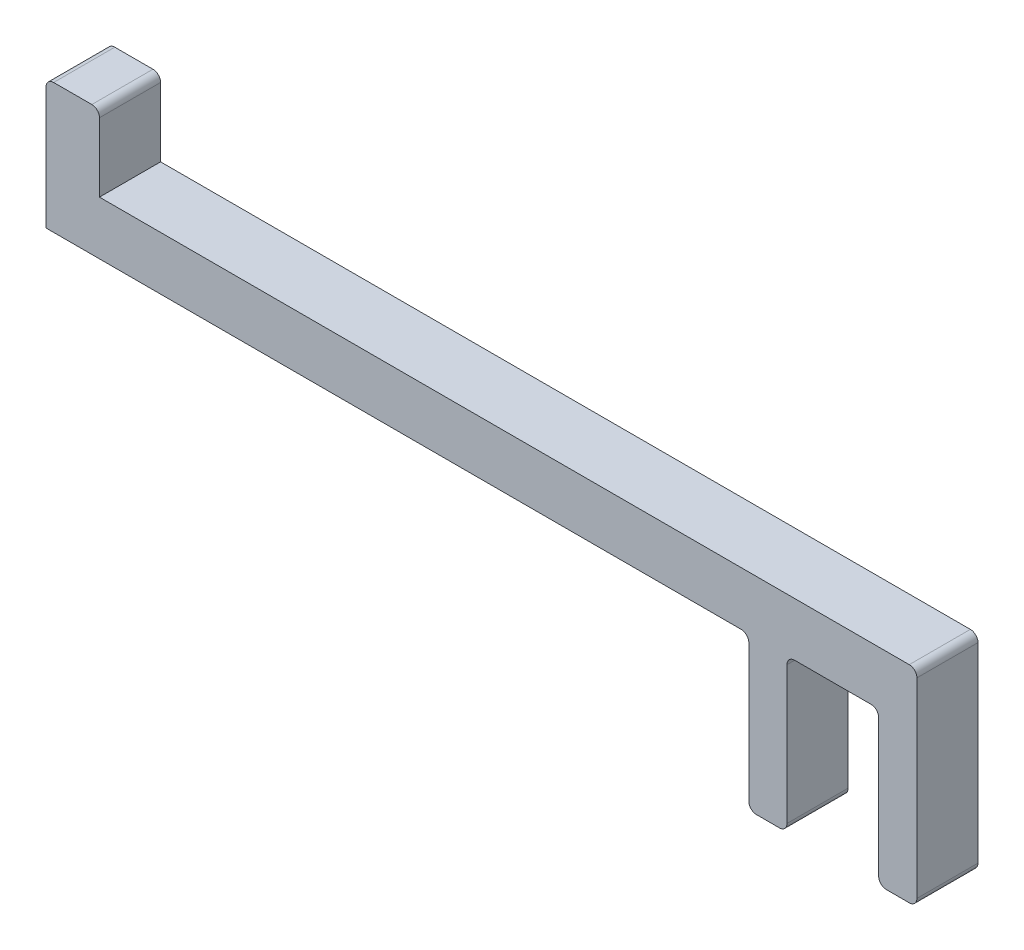
ISO-10303-21;
HEADER;
FILE_DESCRIPTION(('STEP AP214'),'2;1');
FILE_NAME('part.step','',(''),(''),'','','');
FILE_SCHEMA(('AUTOMOTIVE_DESIGN { 1 0 10303 214 1 1 1 1 }'));
ENDSEC;
DATA;
#1=APPLICATION_CONTEXT('core data for automotive mechanical design processes');
#2=APPLICATION_PROTOCOL_DEFINITION('international standard','automotive_design',2000,#1);
#3=PRODUCT_CONTEXT('',#1,'mechanical');
#4=PRODUCT('Part','Part','',(#3));
#5=PRODUCT_RELATED_PRODUCT_CATEGORY('part','',(#4));
#6=PRODUCT_DEFINITION_FORMATION('','',#4);
#7=PRODUCT_DEFINITION_CONTEXT('part definition',#1,'design');
#8=PRODUCT_DEFINITION('design','',#6,#7);
#9=PRODUCT_DEFINITION_SHAPE('','',#8);
#10=(LENGTH_UNIT() NAMED_UNIT(*) SI_UNIT(.MILLI.,.METRE.));
#11=(NAMED_UNIT(*) PLANE_ANGLE_UNIT() SI_UNIT($,.RADIAN.));
#12=(NAMED_UNIT(*) SI_UNIT($,.STERADIAN.) SOLID_ANGLE_UNIT());
#13=UNCERTAINTY_MEASURE_WITH_UNIT(LENGTH_MEASURE(1.E-05),#10,'distance_accuracy_value','');
#14=(GEOMETRIC_REPRESENTATION_CONTEXT(3) GLOBAL_UNCERTAINTY_ASSIGNED_CONTEXT((#13)) GLOBAL_UNIT_ASSIGNED_CONTEXT((#10,
#11,#12)) REPRESENTATION_CONTEXT('',''));
#15=CARTESIAN_POINT('',(0.,0.,0.));
#16=DIRECTION('',(0.,0.,1.));
#17=DIRECTION('',(1.,0.,0.));
#18=AXIS2_PLACEMENT_3D('',#15,#16,#17);
#19=CARTESIAN_POINT('',(42.2657108504677,-1.,12.));
#20=DIRECTION('',(0.,0.,-1.));
#21=DIRECTION('',(-1.,0.,0.));
#22=AXIS2_PLACEMENT_3D('',#19,#20,#21);
#23=CYLINDRICAL_SURFACE('',#22,1.);
#24=DIRECTION('',(0.,0.,-1.));
#25=VECTOR('',#24,1.);
#26=CARTESIAN_POINT('',(42.2657108504677,0.,12.));
#27=LINE('',#26,#25);
#28=CARTESIAN_POINT('',(42.2657108504677,0.,12.));
#29=VERTEX_POINT('',#28);
#30=CARTESIAN_POINT('',(42.2657108504677,0.,4.00000000000001));
#31=VERTEX_POINT('',#30);
#32=EDGE_CURVE('E271',#29,#31,#27,.T.);
#33=ORIENTED_EDGE('',*,*,#32,.T.);
#34=CARTESIAN_POINT('',(42.2657108504677,-1.,4.00000000000001));
#35=DIRECTION('',(0.,0.,1.));
#36=DIRECTION('',(1.,0.,0.));
#37=AXIS2_PLACEMENT_3D('',#34,#35,#36);
#38=CIRCLE('',#37,1.);
#39=CARTESIAN_POINT('',(43.2657108504677,-1.,4.00000000000001));
#40=VERTEX_POINT('',#39);
#41=EDGE_CURVE('E49',#31,#40,#38,.F.);
#42=ORIENTED_EDGE('',*,*,#41,.T.);
#43=DIRECTION('',(0.,0.,-1.));
#44=VECTOR('',#43,1.);
#45=CARTESIAN_POINT('',(43.2657108504677,-1.,12.));
#46=LINE('',#45,#44);
#47=CARTESIAN_POINT('',(43.2657108504677,-1.,12.));
#48=VERTEX_POINT('',#47);
#49=EDGE_CURVE('E42',#48,#40,#46,.T.);
#50=ORIENTED_EDGE('',*,*,#49,.F.);
#51=CARTESIAN_POINT('',(42.2657108504677,-1.,12.));
#52=DIRECTION('',(0.,0.,-1.));
#53=DIRECTION('',(-1.,0.,0.));
#54=AXIS2_PLACEMENT_3D('',#51,#52,#53);
#55=CIRCLE('',#54,1.);
#56=EDGE_CURVE('E270',#29,#48,#55,.T.);
#57=ORIENTED_EDGE('',*,*,#56,.F.);
#58=EDGE_LOOP('',(#33,#42,#50,#57));
#59=FACE_BOUND('',#58,.T.);
#60=ADVANCED_FACE('F35',(#59),#23,.F.);
#61=CARTESIAN_POINT('',(43.2657108504677,-1.,12.));
#62=DIRECTION('',(1.,0.,0.));
#63=DIRECTION('',(0.,0.,-1.));
#64=AXIS2_PLACEMENT_3D('',#61,#62,#63);
#65=PLANE('',#64);
#66=ORIENTED_EDGE('',*,*,#49,.T.);
#67=DIRECTION('',(0.,-1.,0.));
#68=VECTOR('',#67,1.);
#69=CARTESIAN_POINT('',(43.2657108504677,-1.,4.00000000000001));
#70=LINE('',#69,#68);
#71=CARTESIAN_POINT('',(43.2657108504677,-19.,4.00000000000001));
#72=VERTEX_POINT('',#71);
#73=EDGE_CURVE('E265',#40,#72,#70,.T.);
#74=ORIENTED_EDGE('',*,*,#73,.T.);
#75=DIRECTION('',(0.,0.,-1.));
#76=VECTOR('',#75,1.);
#77=CARTESIAN_POINT('',(43.2657108504677,-19.,12.));
#78=LINE('',#77,#76);
#79=CARTESIAN_POINT('',(43.2657108504677,-19.,12.));
#80=VERTEX_POINT('',#79);
#81=EDGE_CURVE('E257',#80,#72,#78,.T.);
#82=ORIENTED_EDGE('',*,*,#81,.F.);
#83=DIRECTION('',(0.,-1.,0.));
#84=VECTOR('',#83,1.);
#85=CARTESIAN_POINT('',(43.2657108504677,-1.,12.));
#86=LINE('',#85,#84);
#87=EDGE_CURVE('E266',#48,#80,#86,.T.);
#88=ORIENTED_EDGE('',*,*,#87,.F.);
#89=EDGE_LOOP('',(#66,#74,#82,#88));
#90=FACE_BOUND('',#89,.T.);
#91=ADVANCED_FACE('F263',(#90),#65,.F.);
#92=CARTESIAN_POINT('',(44.2657108504677,-19.,12.));
#93=DIRECTION('',(0.,0.,-1.));
#94=DIRECTION('',(-1.,0.,0.));
#95=AXIS2_PLACEMENT_3D('',#92,#93,#94);
#96=CYLINDRICAL_SURFACE('',#95,1.);
#97=ORIENTED_EDGE('',*,*,#81,.T.);
#98=CARTESIAN_POINT('',(44.2657108504677,-19.,4.00000000000001));
#99=DIRECTION('',(0.,0.,1.));
#100=DIRECTION('',(1.,0.,0.));
#101=AXIS2_PLACEMENT_3D('',#98,#99,#100);
#102=CIRCLE('',#101,1.);
#103=CARTESIAN_POINT('',(44.2657108504677,-20.,4.00000000000001));
#104=VERTEX_POINT('',#103);
#105=EDGE_CURVE('E273',#72,#104,#102,.T.);
#106=ORIENTED_EDGE('',*,*,#105,.T.);
#107=DIRECTION('',(0.,0.,-1.));
#108=VECTOR('',#107,1.);
#109=CARTESIAN_POINT('',(44.2657108504677,-20.,12.));
#110=LINE('',#109,#108);
#111=CARTESIAN_POINT('',(44.2657108504677,-20.,12.));
#112=VERTEX_POINT('',#111);
#113=EDGE_CURVE('E254',#112,#104,#110,.T.);
#114=ORIENTED_EDGE('',*,*,#113,.F.);
#115=CARTESIAN_POINT('',(44.2657108504677,-19.,12.));
#116=DIRECTION('',(0.,0.,1.));
#117=DIRECTION('',(1.,0.,0.));
#118=AXIS2_PLACEMENT_3D('',#115,#116,#117);
#119=CIRCLE('',#118,1.);
#120=EDGE_CURVE('E325',#80,#112,#119,.T.);
#121=ORIENTED_EDGE('',*,*,#120,.F.);
#122=EDGE_LOOP('',(#97,#106,#114,#121));
#123=FACE_BOUND('',#122,.T.);
#124=ADVANCED_FACE('F432',(#123),#96,.T.);
#125=CARTESIAN_POINT('',(44.2657108504677,-20.,12.));
#126=DIRECTION('',(0.,1.,0.));
#127=DIRECTION('',(0.,0.,1.));
#128=AXIS2_PLACEMENT_3D('',#125,#126,#127);
#129=PLANE('',#128);
#130=ORIENTED_EDGE('',*,*,#113,.T.);
#131=DIRECTION('',(1.,0.,0.));
#132=VECTOR('',#131,1.);
#133=CARTESIAN_POINT('',(44.2657108504677,-20.,4.00000000000001));
#134=LINE('',#133,#132);
#135=CARTESIAN_POINT('',(47.2657108504677,-20.,4.00000000000001));
#136=VERTEX_POINT('',#135);
#137=EDGE_CURVE('E279',#104,#136,#134,.T.);
#138=ORIENTED_EDGE('',*,*,#137,.T.);
#139=DIRECTION('',(0.,0.,-1.));
#140=VECTOR('',#139,1.);
#141=CARTESIAN_POINT('',(47.2657108504677,-20.,12.));
#142=LINE('',#141,#140);
#143=CARTESIAN_POINT('',(47.2657108504677,-20.,12.));
#144=VERTEX_POINT('',#143);
#145=EDGE_CURVE('E251',#144,#136,#142,.T.);
#146=ORIENTED_EDGE('',*,*,#145,.F.);
#147=DIRECTION('',(1.,0.,0.));
#148=VECTOR('',#147,1.);
#149=CARTESIAN_POINT('',(44.2657108504677,-20.,12.));
#150=LINE('',#149,#148);
#151=EDGE_CURVE('E327',#112,#144,#150,.T.);
#152=ORIENTED_EDGE('',*,*,#151,.F.);
#153=EDGE_LOOP('',(#130,#138,#146,#152));
#154=FACE_BOUND('',#153,.T.);
#155=ADVANCED_FACE('F429',(#154),#129,.F.);
#156=CARTESIAN_POINT('',(47.2657108504677,-19.,12.));
#157=DIRECTION('',(0.,0.,-1.));
#158=DIRECTION('',(-1.,0.,0.));
#159=AXIS2_PLACEMENT_3D('',#156,#157,#158);
#160=CYLINDRICAL_SURFACE('',#159,1.);
#161=ORIENTED_EDGE('',*,*,#145,.T.);
#162=CARTESIAN_POINT('',(47.2657108504677,-19.,4.));
#163=DIRECTION('',(0.,0.,1.));
#164=DIRECTION('',(1.,0.,0.));
#165=AXIS2_PLACEMENT_3D('',#162,#163,#164);
#166=CIRCLE('',#165,1.);
#167=CARTESIAN_POINT('',(48.2657108504677,-19.,4.));
#168=VERTEX_POINT('',#167);
#169=EDGE_CURVE('E282',#136,#168,#166,.T.);
#170=ORIENTED_EDGE('',*,*,#169,.T.);
#171=DIRECTION('',(0.,0.,-1.));
#172=VECTOR('',#171,1.);
#173=CARTESIAN_POINT('',(48.2657108504677,-19.,12.));
#174=LINE('',#173,#172);
#175=CARTESIAN_POINT('',(48.2657108504677,-19.,12.));
#176=VERTEX_POINT('',#175);
#177=EDGE_CURVE('E248',#176,#168,#174,.T.);
#178=ORIENTED_EDGE('',*,*,#177,.F.);
#179=CARTESIAN_POINT('',(47.2657108504677,-19.,12.));
#180=DIRECTION('',(0.,0.,1.));
#181=DIRECTION('',(1.,0.,0.));
#182=AXIS2_PLACEMENT_3D('',#179,#180,#181);
#183=CIRCLE('',#182,1.);
#184=EDGE_CURVE('E329',#144,#176,#183,.T.);
#185=ORIENTED_EDGE('',*,*,#184,.F.);
#186=EDGE_LOOP('',(#161,#170,#178,#185));
#187=FACE_BOUND('',#186,.T.);
#188=ADVANCED_FACE('F424',(#187),#160,.T.);
#189=CARTESIAN_POINT('',(48.2657108504677,-19.,12.));
#190=DIRECTION('',(-1.,0.,0.));
#191=DIRECTION('',(0.,0.,1.));
#192=AXIS2_PLACEMENT_3D('',#189,#190,#191);
#193=PLANE('',#192);
#194=ORIENTED_EDGE('',*,*,#177,.T.);
#195=DIRECTION('',(0.,1.,0.));
#196=VECTOR('',#195,1.);
#197=CARTESIAN_POINT('',(48.2657108504677,-19.,4.));
#198=LINE('',#197,#196);
#199=CARTESIAN_POINT('',(48.2657108504677,-1.,4.));
#200=VERTEX_POINT('',#199);
#201=EDGE_CURVE('E285',#168,#200,#198,.T.);
#202=ORIENTED_EDGE('',*,*,#201,.T.);
#203=DIRECTION('',(0.,0.,-1.));
#204=VECTOR('',#203,1.);
#205=CARTESIAN_POINT('',(48.2657108504677,-1.,12.));
#206=LINE('',#205,#204);
#207=CARTESIAN_POINT('',(48.2657108504677,-1.,12.));
#208=VERTEX_POINT('',#207);
#209=EDGE_CURVE('E245',#208,#200,#206,.T.);
#210=ORIENTED_EDGE('',*,*,#209,.F.);
#211=DIRECTION('',(0.,1.,0.));
#212=VECTOR('',#211,1.);
#213=CARTESIAN_POINT('',(48.2657108504677,-19.,12.));
#214=LINE('',#213,#212);
#215=EDGE_CURVE('E331',#176,#208,#214,.T.);
#216=ORIENTED_EDGE('',*,*,#215,.F.);
#217=EDGE_LOOP('',(#194,#202,#210,#216));
#218=FACE_BOUND('',#217,.T.);
#219=ADVANCED_FACE('F421',(#218),#193,.F.);
#220=CARTESIAN_POINT('',(49.2657108504677,-1.,12.));
#221=DIRECTION('',(0.,0.,-1.));
#222=DIRECTION('',(-1.,0.,0.));
#223=AXIS2_PLACEMENT_3D('',#220,#221,#222);
#224=CYLINDRICAL_SURFACE('',#223,1.);
#225=ORIENTED_EDGE('',*,*,#209,.T.);
#226=CARTESIAN_POINT('',(49.2657108504677,-1.,4.));
#227=DIRECTION('',(0.,0.,1.));
#228=DIRECTION('',(1.,0.,0.));
#229=AXIS2_PLACEMENT_3D('',#226,#227,#228);
#230=CIRCLE('',#229,1.);
#231=CARTESIAN_POINT('',(49.2657108504677,0.,4.));
#232=VERTEX_POINT('',#231);
#233=EDGE_CURVE('E288',#200,#232,#230,.F.);
#234=ORIENTED_EDGE('',*,*,#233,.T.);
#235=DIRECTION('',(0.,0.,-1.));
#236=VECTOR('',#235,1.);
#237=CARTESIAN_POINT('',(49.2657108504677,0.,12.));
#238=LINE('',#237,#236);
#239=CARTESIAN_POINT('',(49.2657108504677,0.,12.));
#240=VERTEX_POINT('',#239);
#241=EDGE_CURVE('E242',#240,#232,#238,.T.);
#242=ORIENTED_EDGE('',*,*,#241,.F.);
#243=CARTESIAN_POINT('',(49.2657108504677,-1.,12.));
#244=DIRECTION('',(0.,0.,-1.));
#245=DIRECTION('',(-1.,0.,0.));
#246=AXIS2_PLACEMENT_3D('',#243,#244,#245);
#247=CIRCLE('',#246,1.);
#248=EDGE_CURVE('E333',#208,#240,#247,.T.);
#249=ORIENTED_EDGE('',*,*,#248,.F.);
#250=EDGE_LOOP('',(#225,#234,#242,#249));
#251=FACE_BOUND('',#250,.T.);
#252=ADVANCED_FACE('F416',(#251),#224,.F.);
#253=CARTESIAN_POINT('',(49.2657108504677,0.,12.));
#254=DIRECTION('',(0.,1.,0.));
#255=DIRECTION('',(0.,0.,1.));
#256=AXIS2_PLACEMENT_3D('',#253,#254,#255);
#257=PLANE('',#256);
#258=ORIENTED_EDGE('',*,*,#241,.T.);
#259=DIRECTION('',(1.,0.,0.));
#260=VECTOR('',#259,1.);
#261=CARTESIAN_POINT('',(49.2657108504677,0.,4.));
#262=LINE('',#261,#260);
#263=CARTESIAN_POINT('',(59.2657108504677,0.,4.));
#264=VERTEX_POINT('',#263);
#265=EDGE_CURVE('E291',#232,#264,#262,.T.);
#266=ORIENTED_EDGE('',*,*,#265,.T.);
#267=DIRECTION('',(0.,0.,-1.));
#268=VECTOR('',#267,1.);
#269=CARTESIAN_POINT('',(59.2657108504677,0.,12.));
#270=LINE('',#269,#268);
#271=CARTESIAN_POINT('',(59.2657108504677,0.,12.));
#272=VERTEX_POINT('',#271);
#273=EDGE_CURVE('E239',#272,#264,#270,.T.);
#274=ORIENTED_EDGE('',*,*,#273,.F.);
#275=DIRECTION('',(1.,0.,0.));
#276=VECTOR('',#275,1.);
#277=CARTESIAN_POINT('',(49.2657108504677,0.,12.));
#278=LINE('',#277,#276);
#279=EDGE_CURVE('E335',#240,#272,#278,.T.);
#280=ORIENTED_EDGE('',*,*,#279,.F.);
#281=EDGE_LOOP('',(#258,#266,#274,#280));
#282=FACE_BOUND('',#281,.T.);
#283=ADVANCED_FACE('F413',(#282),#257,.F.);
#284=CARTESIAN_POINT('',(59.2657108504677,-1.,12.));
#285=DIRECTION('',(0.,0.,-1.));
#286=DIRECTION('',(-1.,0.,0.));
#287=AXIS2_PLACEMENT_3D('',#284,#285,#286);
#288=CYLINDRICAL_SURFACE('',#287,1.);
#289=ORIENTED_EDGE('',*,*,#273,.T.);
#290=CARTESIAN_POINT('',(59.2657108504677,-1.,4.));
#291=DIRECTION('',(0.,0.,1.));
#292=DIRECTION('',(1.,0.,0.));
#293=AXIS2_PLACEMENT_3D('',#290,#291,#292);
#294=CIRCLE('',#293,1.);
#295=CARTESIAN_POINT('',(60.2657108504677,-1.,4.));
#296=VERTEX_POINT('',#295);
#297=EDGE_CURVE('E294',#264,#296,#294,.F.);
#298=ORIENTED_EDGE('',*,*,#297,.T.);
#299=DIRECTION('',(0.,0.,-1.));
#300=VECTOR('',#299,1.);
#301=CARTESIAN_POINT('',(60.2657108504677,-1.,12.));
#302=LINE('',#301,#300);
#303=CARTESIAN_POINT('',(60.2657108504677,-1.,12.));
#304=VERTEX_POINT('',#303);
#305=EDGE_CURVE('E236',#304,#296,#302,.T.);
#306=ORIENTED_EDGE('',*,*,#305,.F.);
#307=CARTESIAN_POINT('',(59.2657108504677,-1.,12.));
#308=DIRECTION('',(0.,0.,-1.));
#309=DIRECTION('',(-1.,0.,0.));
#310=AXIS2_PLACEMENT_3D('',#307,#308,#309);
#311=CIRCLE('',#310,1.);
#312=EDGE_CURVE('E337',#272,#304,#311,.T.);
#313=ORIENTED_EDGE('',*,*,#312,.F.);
#314=EDGE_LOOP('',(#289,#298,#306,#313));
#315=FACE_BOUND('',#314,.T.);
#316=ADVANCED_FACE('F408',(#315),#288,.F.);
#317=CARTESIAN_POINT('',(60.2657108504677,-1.,12.));
#318=DIRECTION('',(1.,0.,0.));
#319=DIRECTION('',(0.,1.,0.));
#320=AXIS2_PLACEMENT_3D('',#317,#318,#319);
#321=PLANE('',#320);
#322=ORIENTED_EDGE('',*,*,#305,.T.);
#323=DIRECTION('',(0.,-1.,0.));
#324=VECTOR('',#323,1.);
#325=CARTESIAN_POINT('',(60.2657108504677,-1.,4.));
#326=LINE('',#325,#324);
#327=CARTESIAN_POINT('',(60.2657108504677,-19.,4.));
#328=VERTEX_POINT('',#327);
#329=EDGE_CURVE('E297',#296,#328,#326,.T.);
#330=ORIENTED_EDGE('',*,*,#329,.T.);
#331=DIRECTION('',(0.,0.,-1.));
#332=VECTOR('',#331,1.);
#333=CARTESIAN_POINT('',(60.2657108504677,-19.,12.));
#334=LINE('',#333,#332);
#335=CARTESIAN_POINT('',(60.2657108504677,-19.,12.));
#336=VERTEX_POINT('',#335);
#337=EDGE_CURVE('E233',#336,#328,#334,.T.);
#338=ORIENTED_EDGE('',*,*,#337,.F.);
#339=DIRECTION('',(0.,-1.,0.));
#340=VECTOR('',#339,1.);
#341=CARTESIAN_POINT('',(60.2657108504677,-1.,12.));
#342=LINE('',#341,#340);
#343=EDGE_CURVE('E339',#304,#336,#342,.T.);
#344=ORIENTED_EDGE('',*,*,#343,.F.);
#345=EDGE_LOOP('',(#322,#330,#338,#344));
#346=FACE_BOUND('',#345,.T.);
#347=ADVANCED_FACE('F405',(#346),#321,.F.);
#348=CARTESIAN_POINT('',(61.2657108504677,-19.,12.));
#349=DIRECTION('',(0.,0.,-1.));
#350=DIRECTION('',(-1.,0.,0.));
#351=AXIS2_PLACEMENT_3D('',#348,#349,#350);
#352=CYLINDRICAL_SURFACE('',#351,1.);
#353=ORIENTED_EDGE('',*,*,#337,.T.);
#354=CARTESIAN_POINT('',(61.2657108504677,-19.,4.));
#355=DIRECTION('',(0.,0.,1.));
#356=DIRECTION('',(1.,0.,0.));
#357=AXIS2_PLACEMENT_3D('',#354,#355,#356);
#358=CIRCLE('',#357,1.);
#359=CARTESIAN_POINT('',(61.2657108504677,-20.,4.));
#360=VERTEX_POINT('',#359);
#361=EDGE_CURVE('E300',#328,#360,#358,.T.);
#362=ORIENTED_EDGE('',*,*,#361,.T.);
#363=DIRECTION('',(0.,0.,-1.));
#364=VECTOR('',#363,1.);
#365=CARTESIAN_POINT('',(61.2657108504677,-20.,12.));
#366=LINE('',#365,#364);
#367=CARTESIAN_POINT('',(61.2657108504677,-20.,12.));
#368=VERTEX_POINT('',#367);
#369=EDGE_CURVE('E230',#368,#360,#366,.T.);
#370=ORIENTED_EDGE('',*,*,#369,.F.);
#371=CARTESIAN_POINT('',(61.2657108504677,-19.,12.));
#372=DIRECTION('',(0.,0.,1.));
#373=DIRECTION('',(1.,0.,0.));
#374=AXIS2_PLACEMENT_3D('',#371,#372,#373);
#375=CIRCLE('',#374,1.);
#376=EDGE_CURVE('E341',#336,#368,#375,.T.);
#377=ORIENTED_EDGE('',*,*,#376,.F.);
#378=EDGE_LOOP('',(#353,#362,#370,#377));
#379=FACE_BOUND('',#378,.T.);
#380=ADVANCED_FACE('F400',(#379),#352,.T.);
#381=CARTESIAN_POINT('',(61.2657108504677,-20.,12.));
#382=DIRECTION('',(0.,1.,0.));
#383=DIRECTION('',(0.,0.,1.));
#384=AXIS2_PLACEMENT_3D('',#381,#382,#383);
#385=PLANE('',#384);
#386=ORIENTED_EDGE('',*,*,#369,.T.);
#387=DIRECTION('',(1.,0.,0.));
#388=VECTOR('',#387,1.);
#389=CARTESIAN_POINT('',(61.2657108504677,-20.,4.));
#390=LINE('',#389,#388);
#391=CARTESIAN_POINT('',(64.2657108504677,-20.,4.));
#392=VERTEX_POINT('',#391);
#393=EDGE_CURVE('E303',#360,#392,#390,.T.);
#394=ORIENTED_EDGE('',*,*,#393,.T.);
#395=DIRECTION('',(0.,0.,-1.));
#396=VECTOR('',#395,1.);
#397=CARTESIAN_POINT('',(64.2657108504677,-20.,12.));
#398=LINE('',#397,#396);
#399=CARTESIAN_POINT('',(64.2657108504677,-20.,12.));
#400=VERTEX_POINT('',#399);
#401=EDGE_CURVE('E227',#400,#392,#398,.T.);
#402=ORIENTED_EDGE('',*,*,#401,.F.);
#403=DIRECTION('',(1.,0.,0.));
#404=VECTOR('',#403,1.);
#405=CARTESIAN_POINT('',(61.2657108504677,-20.,12.));
#406=LINE('',#405,#404);
#407=EDGE_CURVE('E343',#368,#400,#406,.T.);
#408=ORIENTED_EDGE('',*,*,#407,.F.);
#409=EDGE_LOOP('',(#386,#394,#402,#408));
#410=FACE_BOUND('',#409,.T.);
#411=ADVANCED_FACE('F397',(#410),#385,.F.);
#412=CARTESIAN_POINT('',(64.2657108504677,-19.,12.));
#413=DIRECTION('',(0.,0.,-1.));
#414=DIRECTION('',(-1.,0.,0.));
#415=AXIS2_PLACEMENT_3D('',#412,#413,#414);
#416=CYLINDRICAL_SURFACE('',#415,1.);
#417=ORIENTED_EDGE('',*,*,#401,.T.);
#418=CARTESIAN_POINT('',(64.2657108504677,-19.,4.));
#419=DIRECTION('',(0.,0.,1.));
#420=DIRECTION('',(1.,0.,0.));
#421=AXIS2_PLACEMENT_3D('',#418,#419,#420);
#422=CIRCLE('',#421,1.);
#423=CARTESIAN_POINT('',(65.2657108504677,-19.,4.));
#424=VERTEX_POINT('',#423);
#425=EDGE_CURVE('E306',#392,#424,#422,.T.);
#426=ORIENTED_EDGE('',*,*,#425,.T.);
#427=DIRECTION('',(0.,0.,-1.));
#428=VECTOR('',#427,1.);
#429=CARTESIAN_POINT('',(65.2657108504677,-19.,12.));
#430=LINE('',#429,#428);
#431=CARTESIAN_POINT('',(65.2657108504677,-19.,12.));
#432=VERTEX_POINT('',#431);
#433=EDGE_CURVE('E224',#432,#424,#430,.T.);
#434=ORIENTED_EDGE('',*,*,#433,.F.);
#435=CARTESIAN_POINT('',(64.2657108504677,-19.,12.));
#436=DIRECTION('',(0.,0.,1.));
#437=DIRECTION('',(1.,0.,0.));
#438=AXIS2_PLACEMENT_3D('',#435,#436,#437);
#439=CIRCLE('',#438,1.);
#440=EDGE_CURVE('E345',#400,#432,#439,.T.);
#441=ORIENTED_EDGE('',*,*,#440,.F.);
#442=EDGE_LOOP('',(#417,#426,#434,#441));
#443=FACE_BOUND('',#442,.T.);
#444=ADVANCED_FACE('F392',(#443),#416,.T.);
#445=CARTESIAN_POINT('',(65.2657108504677,-19.,12.));
#446=DIRECTION('',(-1.,0.,0.));
#447=DIRECTION('',(0.,-1.,0.));
#448=AXIS2_PLACEMENT_3D('',#445,#446,#447);
#449=PLANE('',#448);
#450=ORIENTED_EDGE('',*,*,#433,.T.);
#451=DIRECTION('',(0.,1.,0.));
#452=VECTOR('',#451,1.);
#453=CARTESIAN_POINT('',(65.2657108504677,-19.,4.));
#454=LINE('',#453,#452);
#455=CARTESIAN_POINT('',(65.2657108504677,5.99999999999999,4.));
#456=VERTEX_POINT('',#455);
#457=EDGE_CURVE('E309',#424,#456,#454,.T.);
#458=ORIENTED_EDGE('',*,*,#457,.T.);
#459=DIRECTION('',(0.,0.,-1.));
#460=VECTOR('',#459,1.);
#461=CARTESIAN_POINT('',(65.2657108504677,5.99999999999999,12.));
#462=LINE('',#461,#460);
#463=CARTESIAN_POINT('',(65.2657108504677,5.99999999999999,12.));
#464=VERTEX_POINT('',#463);
#465=EDGE_CURVE('E221',#464,#456,#462,.T.);
#466=ORIENTED_EDGE('',*,*,#465,.F.);
#467=DIRECTION('',(0.,1.,0.));
#468=VECTOR('',#467,1.);
#469=CARTESIAN_POINT('',(65.2657108504677,-19.,12.));
#470=LINE('',#469,#468);
#471=EDGE_CURVE('E347',#432,#464,#470,.T.);
#472=ORIENTED_EDGE('',*,*,#471,.F.);
#473=EDGE_LOOP('',(#450,#458,#466,#472));
#474=FACE_BOUND('',#473,.T.);
#475=ADVANCED_FACE('F389',(#474),#449,.F.);
#476=CARTESIAN_POINT('',(64.2657108504677,5.99999999999999,12.));
#477=DIRECTION('',(0.,0.,-1.));
#478=DIRECTION('',(-1.,0.,0.));
#479=AXIS2_PLACEMENT_3D('',#476,#477,#478);
#480=CYLINDRICAL_SURFACE('',#479,1.00000000000001);
#481=ORIENTED_EDGE('',*,*,#465,.T.);
#482=CARTESIAN_POINT('',(64.2657108504677,5.99999999999999,4.));
#483=DIRECTION('',(0.,0.,1.));
#484=DIRECTION('',(1.,0.,0.));
#485=AXIS2_PLACEMENT_3D('',#482,#483,#484);
#486=CIRCLE('',#485,1.00000000000001);
#487=CARTESIAN_POINT('',(64.2657108504677,7.,4.));
#488=VERTEX_POINT('',#487);
#489=EDGE_CURVE('E312',#456,#488,#486,.T.);
#490=ORIENTED_EDGE('',*,*,#489,.T.);
#491=DIRECTION('',(0.,0.,-1.));
#492=VECTOR('',#491,1.);
#493=CARTESIAN_POINT('',(64.2657108504677,6.99999999999999,12.));
#494=LINE('',#493,#492);
#495=CARTESIAN_POINT('',(64.2657108504677,6.99999999999999,12.));
#496=VERTEX_POINT('',#495);
#497=EDGE_CURVE('E218',#496,#488,#494,.T.);
#498=ORIENTED_EDGE('',*,*,#497,.F.);
#499=CARTESIAN_POINT('',(64.2657108504677,5.99999999999999,12.));
#500=DIRECTION('',(0.,0.,1.));
#501=DIRECTION('',(1.,0.,0.));
#502=AXIS2_PLACEMENT_3D('',#499,#500,#501);
#503=CIRCLE('',#502,1.00000000000001);
#504=EDGE_CURVE('E349',#464,#496,#503,.T.);
#505=ORIENTED_EDGE('',*,*,#504,.F.);
#506=EDGE_LOOP('',(#481,#490,#498,#505));
#507=FACE_BOUND('',#506,.T.);
#508=ADVANCED_FACE('F384',(#507),#480,.T.);
#509=CARTESIAN_POINT('',(-41.7342891495323,6.99999999999999,12.));
#510=DIRECTION('',(0.,-1.,0.));
#511=DIRECTION('',(1.,0.,0.));
#512=AXIS2_PLACEMENT_3D('',#509,#510,#511);
#513=PLANE('',#512);
#514=ORIENTED_EDGE('',*,*,#497,.T.);
#515=DIRECTION('',(-1.,0.,0.));
#516=VECTOR('',#515,1.);
#517=CARTESIAN_POINT('',(-41.7342891495323,6.99999999999999,4.00000000000002));
#518=LINE('',#517,#516);
#519=CARTESIAN_POINT('',(-41.7342891495323,6.99999999999999,4.00000000000002));
#520=VERTEX_POINT('',#519);
#521=EDGE_CURVE('E315',#488,#520,#518,.T.);
#522=ORIENTED_EDGE('',*,*,#521,.T.);
#523=DIRECTION('',(0.,0.,-1.));
#524=VECTOR('',#523,1.);
#525=CARTESIAN_POINT('',(-41.7342891495323,6.99999999999999,12.));
#526=LINE('',#525,#524);
#527=CARTESIAN_POINT('',(-41.7342891495323,6.99999999999999,12.));
#528=VERTEX_POINT('',#527);
#529=EDGE_CURVE('E215',#528,#520,#526,.T.);
#530=ORIENTED_EDGE('',*,*,#529,.F.);
#531=DIRECTION('',(-1.,0.,0.));
#532=VECTOR('',#531,1.);
#533=CARTESIAN_POINT('',(64.2657108504677,6.99999999999999,12.));
#534=LINE('',#533,#532);
#535=EDGE_CURVE('E351',#496,#528,#534,.T.);
#536=ORIENTED_EDGE('',*,*,#535,.F.);
#537=EDGE_LOOP('',(#514,#522,#530,#536));
#538=FACE_BOUND('',#537,.T.);
#539=ADVANCED_FACE('F381',(#538),#513,.F.);
#540=CARTESIAN_POINT('',(-41.7342891495323,16.,12.));
#541=DIRECTION('',(-1.,0.,0.));
#542=DIRECTION('',(0.,0.,1.));
#543=AXIS2_PLACEMENT_3D('',#540,#541,#542);
#544=PLANE('',#543);
#545=ORIENTED_EDGE('',*,*,#529,.T.);
#546=DIRECTION('',(0.,1.,0.));
#547=VECTOR('',#546,1.);
#548=CARTESIAN_POINT('',(-41.7342891495323,16.,4.00000000000002));
#549=LINE('',#548,#547);
#550=CARTESIAN_POINT('',(-41.7342891495323,16.,4.00000000000002));
#551=VERTEX_POINT('',#550);
#552=EDGE_CURVE('E318',#520,#551,#549,.T.);
#553=ORIENTED_EDGE('',*,*,#552,.T.);
#554=DIRECTION('',(0.,0.,-1.));
#555=VECTOR('',#554,1.);
#556=CARTESIAN_POINT('',(-41.7342891495323,16.,12.));
#557=LINE('',#556,#555);
#558=CARTESIAN_POINT('',(-41.7342891495323,16.,12.));
#559=VERTEX_POINT('',#558);
#560=EDGE_CURVE('E207',#559,#551,#557,.T.);
#561=ORIENTED_EDGE('',*,*,#560,.F.);
#562=DIRECTION('',(0.,1.,0.));
#563=VECTOR('',#562,1.);
#564=CARTESIAN_POINT('',(-41.7342891495323,16.,12.));
#565=LINE('',#564,#563);
#566=EDGE_CURVE('E353',#528,#559,#565,.T.);
#567=ORIENTED_EDGE('',*,*,#566,.F.);
#568=EDGE_LOOP('',(#545,#553,#561,#567));
#569=FACE_BOUND('',#568,.T.);
#570=ADVANCED_FACE('F377',(#569),#544,.F.);
#571=CARTESIAN_POINT('',(-42.7342891495323,16.,12.));
#572=DIRECTION('',(0.,0.,-1.));
#573=DIRECTION('',(-1.,0.,0.));
#574=AXIS2_PLACEMENT_3D('',#571,#572,#573);
#575=CYLINDRICAL_SURFACE('',#574,1.00000000000001);
#576=ORIENTED_EDGE('',*,*,#560,.T.);
#577=CARTESIAN_POINT('',(-42.7342891495323,16.,4.00000000000002));
#578=DIRECTION('',(0.,0.,1.));
#579=DIRECTION('',(1.,0.,0.));
#580=AXIS2_PLACEMENT_3D('',#577,#578,#579);
#581=CIRCLE('',#580,1.00000000000001);
#582=CARTESIAN_POINT('',(-42.7342891495323,17.,4.00000000000002));
#583=VERTEX_POINT('',#582);
#584=EDGE_CURVE('E321',#551,#583,#581,.T.);
#585=ORIENTED_EDGE('',*,*,#584,.T.);
#586=DIRECTION('',(0.,0.,-1.));
#587=VECTOR('',#586,1.);
#588=CARTESIAN_POINT('',(-42.7342891495323,17.,12.));
#589=LINE('',#588,#587);
#590=CARTESIAN_POINT('',(-42.7342891495323,17.,12.));
#591=VERTEX_POINT('',#590);
#592=EDGE_CURVE('E201',#591,#583,#589,.T.);
#593=ORIENTED_EDGE('',*,*,#592,.F.);
#594=CARTESIAN_POINT('',(-42.7342891495323,16.,12.));
#595=DIRECTION('',(0.,0.,1.));
#596=DIRECTION('',(-1.,0.,0.));
#597=AXIS2_PLACEMENT_3D('',#594,#595,#596);
#598=CIRCLE('',#597,1.00000000000001);
#599=EDGE_CURVE('E355',#559,#591,#598,.T.);
#600=ORIENTED_EDGE('',*,*,#599,.F.);
#601=EDGE_LOOP('',(#576,#585,#593,#600));
#602=FACE_BOUND('',#601,.T.);
#603=ADVANCED_FACE('F375',(#602),#575,.T.);
#604=CARTESIAN_POINT('',(-47.7342891495323,17.,12.));
#605=DIRECTION('',(0.,-1.,0.));
#606=DIRECTION('',(0.,0.,-1.));
#607=AXIS2_PLACEMENT_3D('',#604,#605,#606);
#608=PLANE('',#607);
#609=ORIENTED_EDGE('',*,*,#592,.T.);
#610=DIRECTION('',(1.,0.,0.));
#611=VECTOR('',#610,1.);
#612=CARTESIAN_POINT('',(81.4238148728054,17.,4.));
#613=LINE('',#612,#611);
#614=CARTESIAN_POINT('',(-47.7342891495323,17.,4.00000000000002));
#615=VERTEX_POINT('',#614);
#616=EDGE_CURVE('E184',#615,#583,#613,.T.);
#617=ORIENTED_EDGE('',*,*,#616,.F.);
#618=DIRECTION('',(0.,0.,-1.));
#619=VECTOR('',#618,1.);
#620=CARTESIAN_POINT('',(-47.7342891495323,17.,12.));
#621=LINE('',#620,#619);
#622=CARTESIAN_POINT('',(-47.7342891495323,17.,12.));
#623=VERTEX_POINT('',#622);
#624=EDGE_CURVE('E198',#623,#615,#621,.T.);
#625=ORIENTED_EDGE('',*,*,#624,.F.);
#626=DIRECTION('',(-1.,0.,0.));
#627=VECTOR('',#626,1.);
#628=CARTESIAN_POINT('',(-47.7342891495323,17.,12.));
#629=LINE('',#628,#627);
#630=EDGE_CURVE('E357',#591,#623,#629,.T.);
#631=ORIENTED_EDGE('',*,*,#630,.F.);
#632=EDGE_LOOP('',(#609,#617,#625,#631));
#633=FACE_BOUND('',#632,.T.);
#634=ADVANCED_FACE('F196',(#633),#608,.F.);
#635=CARTESIAN_POINT('',(-47.7342891495323,16.,12.));
#636=DIRECTION('',(0.,0.,-1.));
#637=DIRECTION('',(-1.,0.,0.));
#638=AXIS2_PLACEMENT_3D('',#635,#636,#637);
#639=CYLINDRICAL_SURFACE('',#638,1.);
#640=ORIENTED_EDGE('',*,*,#624,.T.);
#641=CARTESIAN_POINT('',(-47.7342891495323,16.,4.00000000000002));
#642=DIRECTION('',(0.,0.,1.));
#643=DIRECTION('',(1.,0.,0.));
#644=AXIS2_PLACEMENT_3D('',#641,#642,#643);
#645=CIRCLE('',#644,1.);
#646=CARTESIAN_POINT('',(-48.7342891495323,16.,4.00000000000002));
#647=VERTEX_POINT('',#646);
#648=EDGE_CURVE('E181',#615,#647,#645,.T.);
#649=ORIENTED_EDGE('',*,*,#648,.T.);
#650=DIRECTION('',(0.,0.,-1.));
#651=VECTOR('',#650,1.);
#652=CARTESIAN_POINT('',(-48.7342891495323,16.,12.));
#653=LINE('',#652,#651);
#654=CARTESIAN_POINT('',(-48.7342891495323,16.,12.));
#655=VERTEX_POINT('',#654);
#656=EDGE_CURVE('E205',#655,#647,#653,.T.);
#657=ORIENTED_EDGE('',*,*,#656,.F.);
#658=CARTESIAN_POINT('',(-47.7342891495323,16.,12.));
#659=DIRECTION('',(0.,0.,1.));
#660=DIRECTION('',(-1.,0.,0.));
#661=AXIS2_PLACEMENT_3D('',#658,#659,#660);
#662=CIRCLE('',#661,1.);
#663=EDGE_CURVE('E204',#623,#655,#662,.T.);
#664=ORIENTED_EDGE('',*,*,#663,.F.);
#665=EDGE_LOOP('',(#640,#649,#657,#664));
#666=FACE_BOUND('',#665,.T.);
#667=ADVANCED_FACE('F203',(#666),#639,.T.);
#668=CARTESIAN_POINT('',(-48.7342891495323,16.,12.));
#669=DIRECTION('',(1.,0.,0.));
#670=DIRECTION('',(0.,0.,-1.));
#671=AXIS2_PLACEMENT_3D('',#668,#669,#670);
#672=PLANE('',#671);
#673=ORIENTED_EDGE('',*,*,#656,.T.);
#674=DIRECTION('',(0.,-1.,0.));
#675=VECTOR('',#674,1.);
#676=CARTESIAN_POINT('',(-48.7342891495323,16.,4.00000000000002));
#677=LINE('',#676,#675);
#678=CARTESIAN_POINT('',(-48.7342891495323,0.,4.00000000000002));
#679=VERTEX_POINT('',#678);
#680=EDGE_CURVE('E187',#647,#679,#677,.T.);
#681=ORIENTED_EDGE('',*,*,#680,.T.);
#682=DIRECTION('',(0.,0.,-1.));
#683=VECTOR('',#682,1.);
#684=CARTESIAN_POINT('',(-48.7342891495323,0.,12.));
#685=LINE('',#684,#683);
#686=CARTESIAN_POINT('',(-48.7342891495323,0.,12.));
#687=VERTEX_POINT('',#686);
#688=EDGE_CURVE('E209',#687,#679,#685,.T.);
#689=ORIENTED_EDGE('',*,*,#688,.F.);
#690=DIRECTION('',(0.,-1.,0.));
#691=VECTOR('',#690,1.);
#692=CARTESIAN_POINT('',(-48.7342891495323,16.,12.));
#693=LINE('',#692,#691);
#694=EDGE_CURVE('E360',#655,#687,#693,.T.);
#695=ORIENTED_EDGE('',*,*,#694,.F.);
#696=EDGE_LOOP('',(#673,#681,#689,#695));
#697=FACE_BOUND('',#696,.T.);
#698=ADVANCED_FACE('F369',(#697),#672,.F.);
#699=CARTESIAN_POINT('',(42.2657108504677,0.,12.));
#700=DIRECTION('',(0.,1.,0.));
#701=DIRECTION('',(-1.,0.,0.));
#702=AXIS2_PLACEMENT_3D('',#699,#700,#701);
#703=PLANE('',#702);
#704=ORIENTED_EDGE('',*,*,#688,.T.);
#705=DIRECTION('',(1.,0.,0.));
#706=VECTOR('',#705,1.);
#707=CARTESIAN_POINT('',(42.2657108504677,0.,4.00000000000001));
#708=LINE('',#707,#706);
#709=EDGE_CURVE('E11',#679,#31,#708,.T.);
#710=ORIENTED_EDGE('',*,*,#709,.T.);
#711=ORIENTED_EDGE('',*,*,#32,.F.);
#712=DIRECTION('',(1.,0.,0.));
#713=VECTOR('',#712,1.);
#714=CARTESIAN_POINT('',(42.2657108504677,0.,12.));
#715=LINE('',#714,#713);
#716=EDGE_CURVE('E56',#687,#29,#715,.T.);
#717=ORIENTED_EDGE('',*,*,#716,.F.);
#718=EDGE_LOOP('',(#704,#710,#711,#717));
#719=FACE_BOUND('',#718,.T.);
#720=ADVANCED_FACE('F366',(#719),#703,.F.);
#721=CARTESIAN_POINT('',(42.2657108504677,-1.,12.));
#722=DIRECTION('',(0.,0.,-1.));
#723=DIRECTION('',(-1.,0.,0.));
#724=AXIS2_PLACEMENT_3D('',#721,#722,#723);
#725=PLANE('',#724);
#726=ORIENTED_EDGE('',*,*,#56,.T.);
#727=ORIENTED_EDGE('',*,*,#87,.T.);
#728=ORIENTED_EDGE('',*,*,#120,.T.);
#729=ORIENTED_EDGE('',*,*,#151,.T.);
#730=ORIENTED_EDGE('',*,*,#184,.T.);
#731=ORIENTED_EDGE('',*,*,#215,.T.);
#732=ORIENTED_EDGE('',*,*,#248,.T.);
#733=ORIENTED_EDGE('',*,*,#279,.T.);
#734=ORIENTED_EDGE('',*,*,#312,.T.);
#735=ORIENTED_EDGE('',*,*,#343,.T.);
#736=ORIENTED_EDGE('',*,*,#376,.T.);
#737=ORIENTED_EDGE('',*,*,#407,.T.);
#738=ORIENTED_EDGE('',*,*,#440,.T.);
#739=ORIENTED_EDGE('',*,*,#471,.T.);
#740=ORIENTED_EDGE('',*,*,#504,.T.);
#741=ORIENTED_EDGE('',*,*,#535,.T.);
#742=ORIENTED_EDGE('',*,*,#566,.T.);
#743=ORIENTED_EDGE('',*,*,#599,.T.);
#744=ORIENTED_EDGE('',*,*,#630,.T.);
#745=ORIENTED_EDGE('',*,*,#663,.T.);
#746=ORIENTED_EDGE('',*,*,#694,.T.);
#747=ORIENTED_EDGE('',*,*,#716,.T.);
#748=EDGE_LOOP('',(#726,#727,#728,#729,#730,#731,#732,#733,#734,#735,#736,#737,#738,#739,#740,
#741,#742,#743,#744,#745,#746,#747));
#749=FACE_BOUND('',#748,.T.);
#750=ADVANCED_FACE('F370',(#749),#725,.F.);
#751=CARTESIAN_POINT('',(81.4238148728054,-65.,4.));
#752=DIRECTION('',(0.,0.,1.));
#753=DIRECTION('',(1.,0.,0.));
#754=AXIS2_PLACEMENT_3D('',#751,#752,#753);
#755=PLANE('',#754);
#756=ORIENTED_EDGE('',*,*,#552,.F.);
#757=ORIENTED_EDGE('',*,*,#521,.F.);
#758=ORIENTED_EDGE('',*,*,#489,.F.);
#759=ORIENTED_EDGE('',*,*,#457,.F.);
#760=ORIENTED_EDGE('',*,*,#425,.F.);
#761=ORIENTED_EDGE('',*,*,#393,.F.);
#762=ORIENTED_EDGE('',*,*,#361,.F.);
#763=ORIENTED_EDGE('',*,*,#329,.F.);
#764=ORIENTED_EDGE('',*,*,#297,.F.);
#765=ORIENTED_EDGE('',*,*,#265,.F.);
#766=ORIENTED_EDGE('',*,*,#233,.F.);
#767=ORIENTED_EDGE('',*,*,#201,.F.);
#768=ORIENTED_EDGE('',*,*,#169,.F.);
#769=ORIENTED_EDGE('',*,*,#137,.F.);
#770=ORIENTED_EDGE('',*,*,#105,.F.);
#771=ORIENTED_EDGE('',*,*,#73,.F.);
#772=ORIENTED_EDGE('',*,*,#41,.F.);
#773=ORIENTED_EDGE('',*,*,#709,.F.);
#774=ORIENTED_EDGE('',*,*,#680,.F.);
#775=ORIENTED_EDGE('',*,*,#648,.F.);
#776=ORIENTED_EDGE('',*,*,#616,.T.);
#777=ORIENTED_EDGE('',*,*,#584,.F.);
#778=EDGE_LOOP('',(#756,#757,#758,#759,#760,#761,#762,#763,#764,#765,#766,#767,#768,#769,#770,
#771,#772,#773,#774,#775,#776,#777));
#779=FACE_BOUND('',#778,.T.);
#780=ADVANCED_FACE('F183',(#779),#755,.F.);
#781=CLOSED_SHELL('',(#60,#91,#124,#155,#188,#219,#252,#283,#316,#347,#380,#411,#444,#475,#508,
#539,#570,#603,#634,#667,#698,#720,#750,#780));
#782=MANIFOLD_SOLID_BREP('B2',#781);
#783=ADVANCED_BREP_SHAPE_REPRESENTATION('',(#18,#782),#14);
#784=SHAPE_DEFINITION_REPRESENTATION(#9,#783);
ENDSEC;
END-ISO-10303-21;
